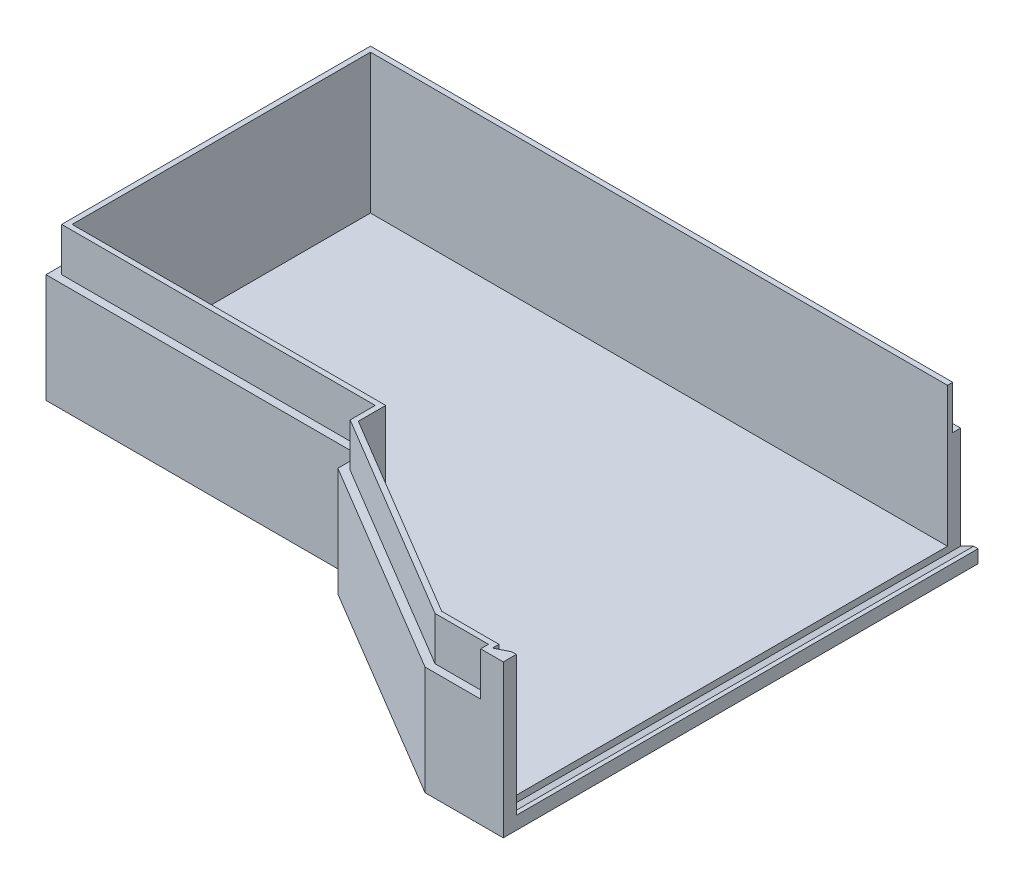
ISO-10303-21;
HEADER;
FILE_DESCRIPTION(('STEP AP214'),'2;1');
FILE_NAME('part.step','',(''),(''),'','','');
FILE_SCHEMA(('AUTOMOTIVE_DESIGN { 1 0 10303 214 1 1 1 1 }'));
ENDSEC;
DATA;
#1=APPLICATION_CONTEXT('core data for automotive mechanical design processes');
#2=APPLICATION_PROTOCOL_DEFINITION('international standard','automotive_design',2000,#1);
#3=PRODUCT_CONTEXT('',#1,'mechanical');
#4=PRODUCT('Part','Part','',(#3));
#5=PRODUCT_RELATED_PRODUCT_CATEGORY('part','',(#4));
#6=PRODUCT_DEFINITION_FORMATION('','',#4);
#7=PRODUCT_DEFINITION_CONTEXT('part definition',#1,'design');
#8=PRODUCT_DEFINITION('design','',#6,#7);
#9=PRODUCT_DEFINITION_SHAPE('','',#8);
#10=(LENGTH_UNIT() NAMED_UNIT(*) SI_UNIT(.MILLI.,.METRE.));
#11=(NAMED_UNIT(*) PLANE_ANGLE_UNIT() SI_UNIT($,.RADIAN.));
#12=(NAMED_UNIT(*) SI_UNIT($,.STERADIAN.) SOLID_ANGLE_UNIT());
#13=UNCERTAINTY_MEASURE_WITH_UNIT(LENGTH_MEASURE(1.E-05),#10,'distance_accuracy_value','');
#14=(GEOMETRIC_REPRESENTATION_CONTEXT(3) GLOBAL_UNCERTAINTY_ASSIGNED_CONTEXT((#13)) GLOBAL_UNIT_ASSIGNED_CONTEXT((#10,
#11,#12)) REPRESENTATION_CONTEXT('',''));
#15=CARTESIAN_POINT('',(0.,0.,0.));
#16=DIRECTION('',(0.,0.,1.));
#17=DIRECTION('',(1.,0.,0.));
#18=AXIS2_PLACEMENT_3D('',#15,#16,#17);
#19=CARTESIAN_POINT('',(118.862351473815,3.,102.5));
#20=DIRECTION('',(0.,0.,1.));
#21=DIRECTION('',(1.,0.,0.));
#22=AXIS2_PLACEMENT_3D('',#19,#20,#21);
#23=PLANE('',#22);
#24=DIRECTION('',(1.,0.,0.));
#25=VECTOR('',#24,1.);
#26=CARTESIAN_POINT('',(118.862351473815,35.,102.5));
#27=LINE('',#26,#25);
#28=CARTESIAN_POINT('',(118.862351473815,35.,102.5));
#29=VERTEX_POINT('',#28);
#30=CARTESIAN_POINT('',(132.,35.,102.5));
#31=VERTEX_POINT('',#30);
#32=EDGE_CURVE('E249',#29,#31,#27,.T.);
#33=ORIENTED_EDGE('',*,*,#32,.T.);
#34=DIRECTION('',(0.,1.,0.));
#35=VECTOR('',#34,1.);
#36=CARTESIAN_POINT('',(132.,1.5,102.5));
#37=LINE('',#36,#35);
#38=CARTESIAN_POINT('',(132.,3.,102.5));
#39=VERTEX_POINT('',#38);
#40=EDGE_CURVE('E370',#39,#31,#37,.T.);
#41=ORIENTED_EDGE('',*,*,#40,.F.);
#42=DIRECTION('',(1.,0.,0.));
#43=VECTOR('',#42,1.);
#44=CARTESIAN_POINT('',(118.862351473815,3.,102.5));
#45=LINE('',#44,#43);
#46=CARTESIAN_POINT('',(118.862351473815,3.,102.5));
#47=VERTEX_POINT('',#46);
#48=EDGE_CURVE('E251',#47,#39,#45,.T.);
#49=ORIENTED_EDGE('',*,*,#48,.F.);
#50=DIRECTION('',(0.,1.,0.));
#51=VECTOR('',#50,1.);
#52=CARTESIAN_POINT('',(118.862351473815,3.,102.5));
#53=LINE('',#52,#51);
#54=EDGE_CURVE('E167',#47,#29,#53,.T.);
#55=ORIENTED_EDGE('',*,*,#54,.T.);
#56=EDGE_LOOP('',(#33,#41,#49,#55));
#57=FACE_BOUND('',#56,.T.);
#58=ADVANCED_FACE('F45',(#57),#23,.F.);
#59=CARTESIAN_POINT('',(0.,3.,0.));
#60=DIRECTION('',(0.,1.,0.));
#61=DIRECTION('',(0.,0.,1.));
#62=AXIS2_PLACEMENT_3D('',#59,#60,#61);
#63=PLANE('',#62);
#64=DIRECTION('',(0.,0.,1.));
#65=VECTOR('',#64,1.);
#66=CARTESIAN_POINT('',(132.,3.,-3.5));
#67=LINE('',#66,#65);
#68=CARTESIAN_POINT('',(132.,3.,-0.5));
#69=VERTEX_POINT('',#68);
#70=EDGE_CURVE('E381',#69,#39,#67,.T.);
#71=ORIENTED_EDGE('',*,*,#70,.F.);
#72=DIRECTION('',(-1.,0.,0.));
#73=VECTOR('',#72,1.);
#74=CARTESIAN_POINT('',(133.,3.,-0.5));
#75=LINE('',#74,#73);
#76=CARTESIAN_POINT('',(-0.5,3.,-0.5));
#77=VERTEX_POINT('',#76);
#78=EDGE_CURVE('E266',#69,#77,#75,.T.);
#79=ORIENTED_EDGE('',*,*,#78,.T.);
#80=DIRECTION('',(0.,0.,1.));
#81=VECTOR('',#80,1.);
#82=CARTESIAN_POINT('',(-0.5,3.,-0.5));
#83=LINE('',#82,#81);
#84=CARTESIAN_POINT('',(-0.5,3.,68.));
#85=VERTEX_POINT('',#84);
#86=EDGE_CURVE('E270',#77,#85,#83,.T.);
#87=ORIENTED_EDGE('',*,*,#86,.T.);
#88=DIRECTION('',(1.,0.,0.));
#89=VECTOR('',#88,1.);
#90=CARTESIAN_POINT('',(-0.5,3.,68.));
#91=LINE('',#90,#89);
#92=CARTESIAN_POINT('',(71.5,3.,68.));
#93=VERTEX_POINT('',#92);
#94=EDGE_CURVE('E319',#85,#93,#91,.T.);
#95=ORIENTED_EDGE('',*,*,#94,.T.);
#96=DIRECTION('',(0.,0.,1.));
#97=VECTOR('',#96,1.);
#98=CARTESIAN_POINT('',(71.5,3.,68.));
#99=LINE('',#98,#97);
#100=CARTESIAN_POINT('',(71.5,3.,74.2841310368762));
#101=VERTEX_POINT('',#100);
#102=EDGE_CURVE('E415',#93,#101,#99,.T.);
#103=ORIENTED_EDGE('',*,*,#102,.T.);
#104=DIRECTION('',(0.859101543908756,0.,0.511805175094578));
#105=VECTOR('',#104,1.);
#106=CARTESIAN_POINT('',(71.5,3.,74.2841310368762));
#107=LINE('',#106,#105);
#108=EDGE_CURVE('E295',#101,#47,#107,.T.);
#109=ORIENTED_EDGE('',*,*,#108,.T.);
#110=ORIENTED_EDGE('',*,*,#48,.T.);
#111=EDGE_LOOP('',(#71,#79,#87,#95,#103,#109,#110));
#112=FACE_BOUND('',#111,.T.);
#113=ADVANCED_FACE('F335',(#112),#63,.T.);
#114=CARTESIAN_POINT('',(-3.5,35.,-3.5));
#115=DIRECTION('',(0.,0.,-1.));
#116=DIRECTION('',(-1.,0.,0.));
#117=AXIS2_PLACEMENT_3D('',#114,#115,#116);
#118=PLANE('',#117);
#119=DIRECTION('',(-0.894427190999916,-0.447213595499958,0.));
#120=VECTOR('',#119,1.);
#121=CARTESIAN_POINT('',(132.,1.5,-3.5));
#122=LINE('',#121,#120);
#123=CARTESIAN_POINT('',(135.,3.,-3.5));
#124=VERTEX_POINT('',#123);
#125=CARTESIAN_POINT('',(132.,1.5,-3.5));
#126=VERTEX_POINT('',#125);
#127=EDGE_CURVE('E450',#124,#126,#122,.T.);
#128=ORIENTED_EDGE('',*,*,#127,.F.);
#129=DIRECTION('',(-1.,0.,0.));
#130=VECTOR('',#129,1.);
#131=CARTESIAN_POINT('',(136.,3.,-3.5));
#132=LINE('',#131,#130);
#133=CARTESIAN_POINT('',(136.,3.,-3.5));
#134=VERTEX_POINT('',#133);
#135=EDGE_CURVE('E397',#134,#124,#132,.T.);
#136=ORIENTED_EDGE('',*,*,#135,.F.);
#137=DIRECTION('',(0.,-1.,0.));
#138=VECTOR('',#137,1.);
#139=CARTESIAN_POINT('',(136.,35.,-3.5));
#140=LINE('',#139,#138);
#141=CARTESIAN_POINT('',(136.,0.,-3.5));
#142=VERTEX_POINT('',#141);
#143=EDGE_CURVE('E151',#134,#142,#140,.T.);
#144=ORIENTED_EDGE('',*,*,#143,.T.);
#145=DIRECTION('',(1.,0.,0.));
#146=VECTOR('',#145,1.);
#147=CARTESIAN_POINT('',(-3.5,0.,-3.5));
#148=LINE('',#147,#146);
#149=CARTESIAN_POINT('',(-3.5,0.,-3.5));
#150=VERTEX_POINT('',#149);
#151=EDGE_CURVE('E122',#150,#142,#148,.T.);
#152=ORIENTED_EDGE('',*,*,#151,.F.);
#153=DIRECTION('',(0.,-1.,0.));
#154=VECTOR('',#153,1.);
#155=CARTESIAN_POINT('',(-3.5,35.,-3.5));
#156=LINE('',#155,#154);
#157=CARTESIAN_POINT('',(-3.5,25.,-3.5));
#158=VERTEX_POINT('',#157);
#159=EDGE_CURVE('E54',#158,#150,#156,.T.);
#160=ORIENTED_EDGE('',*,*,#159,.F.);
#161=DIRECTION('',(-1.,0.,0.));
#162=VECTOR('',#161,1.);
#163=CARTESIAN_POINT('',(-3.5,25.,-3.5));
#164=LINE('',#163,#162);
#165=CARTESIAN_POINT('',(132.,25.,-3.5));
#166=VERTEX_POINT('',#165);
#167=EDGE_CURVE('E502',#166,#158,#164,.T.);
#168=ORIENTED_EDGE('',*,*,#167,.F.);
#169=DIRECTION('',(0.,1.,0.));
#170=VECTOR('',#169,1.);
#171=CARTESIAN_POINT('',(132.,3.,-3.5));
#172=LINE('',#171,#170);
#173=EDGE_CURVE('E401',#126,#166,#172,.T.);
#174=ORIENTED_EDGE('',*,*,#173,.F.);
#175=EDGE_LOOP('',(#128,#136,#144,#152,#160,#168,#174));
#176=FACE_BOUND('',#175,.T.);
#177=ADVANCED_FACE('F341',(#176),#118,.T.);
#178=CARTESIAN_POINT('',(-3.5,35.,-3.5));
#179=DIRECTION('',(1.,0.,0.));
#180=DIRECTION('',(0.,0.,-1.));
#181=AXIS2_PLACEMENT_3D('',#178,#179,#180);
#182=PLANE('',#181);
#183=DIRECTION('',(0.,-1.,0.));
#184=VECTOR('',#183,1.);
#185=CARTESIAN_POINT('',(-3.5,35.,71.));
#186=LINE('',#185,#184);
#187=CARTESIAN_POINT('',(-3.5,25.,71.));
#188=VERTEX_POINT('',#187);
#189=CARTESIAN_POINT('',(-3.5,0.,71.));
#190=VERTEX_POINT('',#189);
#191=EDGE_CURVE('E99',#188,#190,#186,.T.);
#192=ORIENTED_EDGE('',*,*,#191,.F.);
#193=DIRECTION('',(0.,0.,1.));
#194=VECTOR('',#193,1.);
#195=CARTESIAN_POINT('',(-3.5,25.,71.));
#196=LINE('',#195,#194);
#197=EDGE_CURVE('E506',#158,#188,#196,.T.);
#198=ORIENTED_EDGE('',*,*,#197,.F.);
#199=ORIENTED_EDGE('',*,*,#159,.T.);
#200=DIRECTION('',(0.,0.,1.));
#201=VECTOR('',#200,1.);
#202=CARTESIAN_POINT('',(-3.5,0.,-3.5));
#203=LINE('',#202,#201);
#204=EDGE_CURVE('E115',#150,#190,#203,.T.);
#205=ORIENTED_EDGE('',*,*,#204,.T.);
#206=EDGE_LOOP('',(#192,#198,#199,#205));
#207=FACE_BOUND('',#206,.T.);
#208=ADVANCED_FACE('F116',(#207),#182,.F.);
#209=CARTESIAN_POINT('',(-3.5,35.,71.));
#210=DIRECTION('',(0.,0.,-1.));
#211=DIRECTION('',(-1.,0.,0.));
#212=AXIS2_PLACEMENT_3D('',#209,#210,#211);
#213=PLANE('',#212);
#214=DIRECTION('',(0.,-1.,0.));
#215=VECTOR('',#214,1.);
#216=CARTESIAN_POINT('',(68.5,35.,71.));
#217=LINE('',#216,#215);
#218=CARTESIAN_POINT('',(68.5,25.,71.));
#219=VERTEX_POINT('',#218);
#220=CARTESIAN_POINT('',(68.5,0.,71.));
#221=VERTEX_POINT('',#220);
#222=EDGE_CURVE('E112',#219,#221,#217,.T.);
#223=ORIENTED_EDGE('',*,*,#222,.F.);
#224=DIRECTION('',(1.,0.,0.));
#225=VECTOR('',#224,1.);
#226=CARTESIAN_POINT('',(68.5,25.,71.));
#227=LINE('',#226,#225);
#228=EDGE_CURVE('E108',#188,#219,#227,.T.);
#229=ORIENTED_EDGE('',*,*,#228,.F.);
#230=ORIENTED_EDGE('',*,*,#191,.T.);
#231=DIRECTION('',(1.,0.,0.));
#232=VECTOR('',#231,1.);
#233=CARTESIAN_POINT('',(-3.5,0.,71.));
#234=LINE('',#233,#232);
#235=EDGE_CURVE('E104',#190,#221,#234,.T.);
#236=ORIENTED_EDGE('',*,*,#235,.T.);
#237=EDGE_LOOP('',(#223,#229,#230,#236));
#238=FACE_BOUND('',#237,.T.);
#239=ADVANCED_FACE('F102',(#238),#213,.F.);
#240=CARTESIAN_POINT('',(68.5,35.,71.));
#241=DIRECTION('',(1.,0.,0.));
#242=DIRECTION('',(0.,0.,-1.));
#243=AXIS2_PLACEMENT_3D('',#240,#241,#242);
#244=PLANE('',#243);
#245=DIRECTION('',(0.,-1.,0.));
#246=VECTOR('',#245,1.);
#247=CARTESIAN_POINT('',(68.5,35.,75.9889172581332));
#248=LINE('',#247,#246);
#249=CARTESIAN_POINT('',(68.5,25.,75.9889172581332));
#250=VERTEX_POINT('',#249);
#251=CARTESIAN_POINT('',(68.5,0.,75.9889172581332));
#252=VERTEX_POINT('',#251);
#253=EDGE_CURVE('E142',#250,#252,#248,.T.);
#254=ORIENTED_EDGE('',*,*,#253,.F.);
#255=DIRECTION('',(0.,0.,1.));
#256=VECTOR('',#255,1.);
#257=CARTESIAN_POINT('',(68.5,25.,75.9889172581332));
#258=LINE('',#257,#256);
#259=EDGE_CURVE('E462',#219,#250,#258,.T.);
#260=ORIENTED_EDGE('',*,*,#259,.F.);
#261=ORIENTED_EDGE('',*,*,#222,.T.);
#262=DIRECTION('',(0.,0.,1.));
#263=VECTOR('',#262,1.);
#264=CARTESIAN_POINT('',(68.5,0.,71.));
#265=LINE('',#264,#263);
#266=EDGE_CURVE('E127',#221,#252,#265,.T.);
#267=ORIENTED_EDGE('',*,*,#266,.T.);
#268=EDGE_LOOP('',(#254,#260,#261,#267));
#269=FACE_BOUND('',#268,.T.);
#270=ADVANCED_FACE('F636',(#269),#244,.F.);
#271=CARTESIAN_POINT('',(68.5,35.,75.9889172581332));
#272=DIRECTION('',(0.511805175094578,0.,-0.859101543908756));
#273=DIRECTION('',(-0.859101543908756,0.,-0.511805175094578));
#274=AXIS2_PLACEMENT_3D('',#271,#272,#273);
#275=PLANE('',#274);
#276=DIRECTION('',(0.,-1.,0.));
#277=VECTOR('',#276,1.);
#278=CARTESIAN_POINT('',(118.036460316705,35.,105.5));
#279=LINE('',#278,#277);
#280=CARTESIAN_POINT('',(118.036460316705,25.,105.5));
#281=VERTEX_POINT('',#280);
#282=CARTESIAN_POINT('',(118.036460316705,0.,105.5));
#283=VERTEX_POINT('',#282);
#284=EDGE_CURVE('E145',#281,#283,#279,.T.);
#285=ORIENTED_EDGE('',*,*,#284,.F.);
#286=DIRECTION('',(0.859101543908756,0.,0.511805175094578));
#287=VECTOR('',#286,1.);
#288=CARTESIAN_POINT('',(118.036460316705,25.,105.5));
#289=LINE('',#288,#287);
#290=EDGE_CURVE('E466',#250,#281,#289,.T.);
#291=ORIENTED_EDGE('',*,*,#290,.F.);
#292=ORIENTED_EDGE('',*,*,#253,.T.);
#293=DIRECTION('',(0.859101543908756,0.,0.511805175094578));
#294=VECTOR('',#293,1.);
#295=CARTESIAN_POINT('',(68.5,0.,75.9889172581332));
#296=LINE('',#295,#294);
#297=EDGE_CURVE('E131',#252,#283,#296,.T.);
#298=ORIENTED_EDGE('',*,*,#297,.T.);
#299=EDGE_LOOP('',(#285,#291,#292,#298));
#300=FACE_BOUND('',#299,.T.);
#301=ADVANCED_FACE('F174',(#300),#275,.F.);
#302=CARTESIAN_POINT('',(135.,35.,105.5));
#303=DIRECTION('',(0.,0.,1.));
#304=DIRECTION('',(1.,0.,0.));
#305=AXIS2_PLACEMENT_3D('',#302,#303,#304);
#306=PLANE('',#305);
#307=DIRECTION('',(0.,1.,0.));
#308=VECTOR('',#307,1.);
#309=CARTESIAN_POINT('',(130.8,25.,105.5));
#310=LINE('',#309,#308);
#311=CARTESIAN_POINT('',(130.8,25.,105.5));
#312=VERTEX_POINT('',#311);
#313=CARTESIAN_POINT('',(130.8,35.,105.5));
#314=VERTEX_POINT('',#313);
#315=EDGE_CURVE('E509',#312,#314,#310,.T.);
#316=ORIENTED_EDGE('',*,*,#315,.F.);
#317=DIRECTION('',(1.,0.,0.));
#318=VECTOR('',#317,1.);
#319=CARTESIAN_POINT('',(130.8,25.,105.5));
#320=LINE('',#319,#318);
#321=EDGE_CURVE('E470',#281,#312,#320,.T.);
#322=ORIENTED_EDGE('',*,*,#321,.F.);
#323=ORIENTED_EDGE('',*,*,#284,.T.);
#324=DIRECTION('',(-1.,0.,0.));
#325=VECTOR('',#324,1.);
#326=CARTESIAN_POINT('',(135.,0.,105.5));
#327=LINE('',#326,#325);
#328=CARTESIAN_POINT('',(136.,0.,105.5));
#329=VERTEX_POINT('',#328);
#330=EDGE_CURVE('E166',#329,#283,#327,.T.);
#331=ORIENTED_EDGE('',*,*,#330,.F.);
#332=DIRECTION('',(0.,-1.,0.));
#333=VECTOR('',#332,1.);
#334=CARTESIAN_POINT('',(136.,35.,105.5));
#335=LINE('',#334,#333);
#336=CARTESIAN_POINT('',(136.,35.,105.5));
#337=VERTEX_POINT('',#336);
#338=EDGE_CURVE('E148',#337,#329,#335,.T.);
#339=ORIENTED_EDGE('',*,*,#338,.F.);
#340=DIRECTION('',(1.,0.,0.));
#341=VECTOR('',#340,1.);
#342=CARTESIAN_POINT('',(135.,35.,105.5));
#343=LINE('',#342,#341);
#344=EDGE_CURVE('E70',#314,#337,#343,.T.);
#345=ORIENTED_EDGE('',*,*,#344,.F.);
#346=EDGE_LOOP('',(#316,#322,#323,#331,#339,#345));
#347=FACE_BOUND('',#346,.T.);
#348=ADVANCED_FACE('F182',(#347),#306,.T.);
#349=CARTESIAN_POINT('',(136.,35.,-3.5));
#350=DIRECTION('',(1.,0.,0.));
#351=DIRECTION('',(0.,0.,-1.));
#352=AXIS2_PLACEMENT_3D('',#349,#350,#351);
#353=PLANE('',#352);
#354=DIRECTION('',(0.,1.,0.));
#355=VECTOR('',#354,1.);
#356=CARTESIAN_POINT('',(136.,3.,102.5));
#357=LINE('',#356,#355);
#358=CARTESIAN_POINT('',(136.,3.,102.5));
#359=VERTEX_POINT('',#358);
#360=CARTESIAN_POINT('',(136.,35.,102.5));
#361=VERTEX_POINT('',#360);
#362=EDGE_CURVE('E189',#359,#361,#357,.T.);
#363=ORIENTED_EDGE('',*,*,#362,.T.);
#364=DIRECTION('',(0.,0.,1.));
#365=VECTOR('',#364,1.);
#366=CARTESIAN_POINT('',(136.,35.,-3.5));
#367=LINE('',#366,#365);
#368=EDGE_CURVE('E137',#361,#337,#367,.T.);
#369=ORIENTED_EDGE('',*,*,#368,.T.);
#370=ORIENTED_EDGE('',*,*,#338,.T.);
#371=DIRECTION('',(0.,0.,1.));
#372=VECTOR('',#371,1.);
#373=CARTESIAN_POINT('',(136.,0.,-3.5));
#374=LINE('',#373,#372);
#375=EDGE_CURVE('E162',#142,#329,#374,.T.);
#376=ORIENTED_EDGE('',*,*,#375,.F.);
#377=ORIENTED_EDGE('',*,*,#143,.F.);
#378=DIRECTION('',(0.,0.,-1.));
#379=VECTOR('',#378,1.);
#380=CARTESIAN_POINT('',(136.,3.,-3.5));
#381=LINE('',#380,#379);
#382=EDGE_CURVE('E394',#359,#134,#381,.T.);
#383=ORIENTED_EDGE('',*,*,#382,.F.);
#384=EDGE_LOOP('',(#363,#369,#370,#376,#377,#383));
#385=FACE_BOUND('',#384,.T.);
#386=ADVANCED_FACE('F47',(#385),#353,.T.);
#387=CARTESIAN_POINT('',(0.,35.,0.));
#388=DIRECTION('',(0.,-1.,0.));
#389=DIRECTION('',(0.,0.,-1.));
#390=AXIS2_PLACEMENT_3D('',#387,#388,#389);
#391=PLANE('',#390);
#392=CARTESIAN_POINT('',(135.,35.,102.5));
#393=VERTEX_POINT('',#392);
#394=EDGE_CURVE('E195',#393,#361,#27,.T.);
#395=ORIENTED_EDGE('',*,*,#394,.F.);
#396=DIRECTION('',(-0.894427190999916,0.,0.447213595499958));
#397=VECTOR('',#396,1.);
#398=CARTESIAN_POINT('',(132.,35.,104.));
#399=LINE('',#398,#397);
#400=CARTESIAN_POINT('',(132.,35.,104.));
#401=VERTEX_POINT('',#400);
#402=EDGE_CURVE('E367',#393,#401,#399,.T.);
#403=ORIENTED_EDGE('',*,*,#402,.T.);
#404=DIRECTION('',(0.,0.,-1.));
#405=VECTOR('',#404,1.);
#406=CARTESIAN_POINT('',(132.,35.,104.));
#407=LINE('',#406,#405);
#408=EDGE_CURVE('E264',#401,#31,#407,.T.);
#409=ORIENTED_EDGE('',*,*,#408,.T.);
#410=ORIENTED_EDGE('',*,*,#32,.F.);
#411=DIRECTION('',(0.859101543908756,0.,0.511805175094578));
#412=VECTOR('',#411,1.);
#413=CARTESIAN_POINT('',(71.5,35.,74.2841310368762));
#414=LINE('',#413,#412);
#415=CARTESIAN_POINT('',(71.5,35.,74.2841310368762));
#416=VERTEX_POINT('',#415);
#417=EDGE_CURVE('E256',#416,#29,#414,.T.);
#418=ORIENTED_EDGE('',*,*,#417,.F.);
#419=DIRECTION('',(0.,0.,1.));
#420=VECTOR('',#419,1.);
#421=CARTESIAN_POINT('',(71.5,35.,68.));
#422=LINE('',#421,#420);
#423=CARTESIAN_POINT('',(71.5,35.,68.));
#424=VERTEX_POINT('',#423);
#425=EDGE_CURVE('E260',#424,#416,#422,.T.);
#426=ORIENTED_EDGE('',*,*,#425,.F.);
#427=DIRECTION('',(1.,0.,0.));
#428=VECTOR('',#427,1.);
#429=CARTESIAN_POINT('',(-0.5,35.,68.));
#430=LINE('',#429,#428);
#431=CARTESIAN_POINT('',(-0.5,35.,68.));
#432=VERTEX_POINT('',#431);
#433=EDGE_CURVE('E306',#432,#424,#430,.T.);
#434=ORIENTED_EDGE('',*,*,#433,.F.);
#435=DIRECTION('',(0.,0.,1.));
#436=VECTOR('',#435,1.);
#437=CARTESIAN_POINT('',(-0.5,35.,-0.5));
#438=LINE('',#437,#436);
#439=CARTESIAN_POINT('',(-0.5,35.,-0.5));
#440=VERTEX_POINT('',#439);
#441=EDGE_CURVE('E302',#440,#432,#438,.T.);
#442=ORIENTED_EDGE('',*,*,#441,.F.);
#443=DIRECTION('',(-1.,0.,0.));
#444=VECTOR('',#443,1.);
#445=CARTESIAN_POINT('',(133.,35.,-0.5));
#446=LINE('',#445,#444);
#447=CARTESIAN_POINT('',(132.,35.,-0.5));
#448=VERTEX_POINT('',#447);
#449=EDGE_CURVE('E299',#448,#440,#446,.T.);
#450=ORIENTED_EDGE('',*,*,#449,.F.);
#451=DIRECTION('',(0.,0.,1.));
#452=VECTOR('',#451,1.);
#453=CARTESIAN_POINT('',(132.,35.,-3.5));
#454=LINE('',#453,#452);
#455=CARTESIAN_POINT('',(132.,35.,-1.7));
#456=VERTEX_POINT('',#455);
#457=EDGE_CURVE('E386',#456,#448,#454,.T.);
#458=ORIENTED_EDGE('',*,*,#457,.F.);
#459=DIRECTION('',(1.,0.,0.));
#460=VECTOR('',#459,1.);
#461=CARTESIAN_POINT('',(132.,35.,-1.7));
#462=LINE('',#461,#460);
#463=CARTESIAN_POINT('',(-1.7,35.,-1.7));
#464=VERTEX_POINT('',#463);
#465=EDGE_CURVE('E431',#464,#456,#462,.T.);
#466=ORIENTED_EDGE('',*,*,#465,.F.);
#467=DIRECTION('',(0.,0.,-1.));
#468=VECTOR('',#467,1.);
#469=CARTESIAN_POINT('',(-1.7,35.,-1.7));
#470=LINE('',#469,#468);
#471=CARTESIAN_POINT('',(-1.7,35.,69.2));
#472=VERTEX_POINT('',#471);
#473=EDGE_CURVE('E526',#472,#464,#470,.T.);
#474=ORIENTED_EDGE('',*,*,#473,.F.);
#475=DIRECTION('',(-1.,0.,0.));
#476=VECTOR('',#475,1.);
#477=CARTESIAN_POINT('',(-1.7,35.,69.2));
#478=LINE('',#477,#476);
#479=CARTESIAN_POINT('',(70.3,35.,69.2));
#480=VERTEX_POINT('',#479);
#481=EDGE_CURVE('E522',#480,#472,#478,.T.);
#482=ORIENTED_EDGE('',*,*,#481,.F.);
#483=DIRECTION('',(0.,0.,-1.));
#484=VECTOR('',#483,1.);
#485=CARTESIAN_POINT('',(70.3,35.,69.2));
#486=LINE('',#485,#484);
#487=CARTESIAN_POINT('',(70.3,35.,74.966045525379));
#488=VERTEX_POINT('',#487);
#489=EDGE_CURVE('E518',#488,#480,#486,.T.);
#490=ORIENTED_EDGE('',*,*,#489,.F.);
#491=DIRECTION('',(-0.859101543908756,0.,-0.511805175094578));
#492=VECTOR('',#491,1.);
#493=CARTESIAN_POINT('',(70.3,35.,74.966045525379));
#494=LINE('',#493,#492);
#495=CARTESIAN_POINT('',(118.531995010971,35.,103.7));
#496=VERTEX_POINT('',#495);
#497=EDGE_CURVE('E514',#496,#488,#494,.T.);
#498=ORIENTED_EDGE('',*,*,#497,.F.);
#499=DIRECTION('',(-1.,0.,0.));
#500=VECTOR('',#499,1.);
#501=CARTESIAN_POINT('',(118.531995010971,35.,103.7));
#502=LINE('',#501,#500);
#503=CARTESIAN_POINT('',(130.8,35.,103.7));
#504=VERTEX_POINT('',#503);
#505=EDGE_CURVE('E455',#504,#496,#502,.T.);
#506=ORIENTED_EDGE('',*,*,#505,.F.);
#507=DIRECTION('',(0.,0.,-1.));
#508=VECTOR('',#507,1.);
#509=CARTESIAN_POINT('',(130.8,35.,103.7));
#510=LINE('',#509,#508);
#511=EDGE_CURVE('E449',#314,#504,#510,.T.);
#512=ORIENTED_EDGE('',*,*,#511,.F.);
#513=ORIENTED_EDGE('',*,*,#344,.T.);
#514=ORIENTED_EDGE('',*,*,#368,.F.);
#515=EDGE_LOOP('',(#395,#403,#409,#410,#418,#426,#434,#442,#450,#458,#466,#474,#482,#490,#498,
#506,#512,#513,#514));
#516=FACE_BOUND('',#515,.T.);
#517=ADVANCED_FACE('F191',(#516),#391,.F.);
#518=CARTESIAN_POINT('',(0.,0.,0.));
#519=DIRECTION('',(0.,-1.,0.));
#520=DIRECTION('',(0.,0.,-1.));
#521=AXIS2_PLACEMENT_3D('',#518,#519,#520);
#522=PLANE('',#521);
#523=ORIENTED_EDGE('',*,*,#151,.T.);
#524=ORIENTED_EDGE('',*,*,#375,.T.);
#525=ORIENTED_EDGE('',*,*,#330,.T.);
#526=ORIENTED_EDGE('',*,*,#297,.F.);
#527=ORIENTED_EDGE('',*,*,#266,.F.);
#528=ORIENTED_EDGE('',*,*,#235,.F.);
#529=ORIENTED_EDGE('',*,*,#204,.F.);
#530=EDGE_LOOP('',(#523,#524,#525,#526,#527,#528,#529));
#531=FACE_BOUND('',#530,.T.);
#532=ADVANCED_FACE('F124',(#531),#522,.T.);
#533=CARTESIAN_POINT('',(135.,3.,102.5));
#534=VERTEX_POINT('',#533);
#535=EDGE_CURVE('E290',#534,#359,#45,.T.);
#536=ORIENTED_EDGE('',*,*,#535,.F.);
#537=DIRECTION('',(0.,-1.,0.));
#538=VECTOR('',#537,1.);
#539=CARTESIAN_POINT('',(135.,1.5,102.5));
#540=LINE('',#539,#538);
#541=EDGE_CURVE('E355',#393,#534,#540,.T.);
#542=ORIENTED_EDGE('',*,*,#541,.F.);
#543=ORIENTED_EDGE('',*,*,#394,.T.);
#544=ORIENTED_EDGE('',*,*,#362,.F.);
#545=EDGE_LOOP('',(#536,#542,#543,#544));
#546=FACE_BOUND('',#545,.T.);
#547=ADVANCED_FACE('F337',(#546),#23,.F.);
#548=CARTESIAN_POINT('',(71.5,3.,74.2841310368762));
#549=DIRECTION('',(-0.511805175094578,0.,0.859101543908756));
#550=DIRECTION('',(0.859101543908756,0.,0.511805175094578));
#551=AXIS2_PLACEMENT_3D('',#548,#549,#550);
#552=PLANE('',#551);
#553=ORIENTED_EDGE('',*,*,#417,.T.);
#554=ORIENTED_EDGE('',*,*,#54,.F.);
#555=ORIENTED_EDGE('',*,*,#108,.F.);
#556=DIRECTION('',(0.,1.,0.));
#557=VECTOR('',#556,1.);
#558=CARTESIAN_POINT('',(71.5,3.,74.2841310368762));
#559=LINE('',#558,#557);
#560=EDGE_CURVE('E240',#101,#416,#559,.T.);
#561=ORIENTED_EDGE('',*,*,#560,.T.);
#562=EDGE_LOOP('',(#553,#554,#555,#561));
#563=FACE_BOUND('',#562,.T.);
#564=ADVANCED_FACE('F257',(#563),#552,.F.);
#565=CARTESIAN_POINT('',(71.5,3.,68.));
#566=DIRECTION('',(-1.,0.,0.));
#567=DIRECTION('',(0.,0.,1.));
#568=AXIS2_PLACEMENT_3D('',#565,#566,#567);
#569=PLANE('',#568);
#570=ORIENTED_EDGE('',*,*,#425,.T.);
#571=ORIENTED_EDGE('',*,*,#560,.F.);
#572=ORIENTED_EDGE('',*,*,#102,.F.);
#573=DIRECTION('',(0.,1.,0.));
#574=VECTOR('',#573,1.);
#575=CARTESIAN_POINT('',(71.5,3.,68.));
#576=LINE('',#575,#574);
#577=EDGE_CURVE('E276',#93,#424,#576,.T.);
#578=ORIENTED_EDGE('',*,*,#577,.T.);
#579=EDGE_LOOP('',(#570,#571,#572,#578));
#580=FACE_BOUND('',#579,.T.);
#581=ADVANCED_FACE('F311',(#580),#569,.F.);
#582=CARTESIAN_POINT('',(-0.5,3.,68.));
#583=DIRECTION('',(0.,0.,1.));
#584=DIRECTION('',(1.,0.,0.));
#585=AXIS2_PLACEMENT_3D('',#582,#583,#584);
#586=PLANE('',#585);
#587=ORIENTED_EDGE('',*,*,#433,.T.);
#588=ORIENTED_EDGE('',*,*,#577,.F.);
#589=ORIENTED_EDGE('',*,*,#94,.F.);
#590=DIRECTION('',(0.,1.,0.));
#591=VECTOR('',#590,1.);
#592=CARTESIAN_POINT('',(-0.5,3.,68.));
#593=LINE('',#592,#591);
#594=EDGE_CURVE('E279',#85,#432,#593,.T.);
#595=ORIENTED_EDGE('',*,*,#594,.T.);
#596=EDGE_LOOP('',(#587,#588,#589,#595));
#597=FACE_BOUND('',#596,.T.);
#598=ADVANCED_FACE('F316',(#597),#586,.F.);
#599=CARTESIAN_POINT('',(-0.5,3.,-0.5));
#600=DIRECTION('',(-1.,0.,0.));
#601=DIRECTION('',(0.,0.,1.));
#602=AXIS2_PLACEMENT_3D('',#599,#600,#601);
#603=PLANE('',#602);
#604=ORIENTED_EDGE('',*,*,#441,.T.);
#605=ORIENTED_EDGE('',*,*,#594,.F.);
#606=ORIENTED_EDGE('',*,*,#86,.F.);
#607=DIRECTION('',(0.,1.,0.));
#608=VECTOR('',#607,1.);
#609=CARTESIAN_POINT('',(-0.5,3.,-0.5));
#610=LINE('',#609,#608);
#611=EDGE_CURVE('E281',#77,#440,#610,.T.);
#612=ORIENTED_EDGE('',*,*,#611,.T.);
#613=EDGE_LOOP('',(#604,#605,#606,#612));
#614=FACE_BOUND('',#613,.T.);
#615=ADVANCED_FACE('F321',(#614),#603,.F.);
#616=CARTESIAN_POINT('',(133.,3.,-0.5));
#617=DIRECTION('',(0.,0.,-1.));
#618=DIRECTION('',(-1.,0.,0.));
#619=AXIS2_PLACEMENT_3D('',#616,#617,#618);
#620=PLANE('',#619);
#621=ORIENTED_EDGE('',*,*,#78,.F.);
#622=DIRECTION('',(0.,1.,0.));
#623=VECTOR('',#622,1.);
#624=CARTESIAN_POINT('',(132.,3.,-0.5));
#625=LINE('',#624,#623);
#626=EDGE_CURVE('E303',#69,#448,#625,.T.);
#627=ORIENTED_EDGE('',*,*,#626,.T.);
#628=ORIENTED_EDGE('',*,*,#449,.T.);
#629=ORIENTED_EDGE('',*,*,#611,.F.);
#630=EDGE_LOOP('',(#621,#627,#628,#629));
#631=FACE_BOUND('',#630,.T.);
#632=ADVANCED_FACE('F323',(#631),#620,.F.);
#633=DIRECTION('',(0.,0.,-1.));
#634=VECTOR('',#633,1.);
#635=CARTESIAN_POINT('',(135.,3.,-3.5));
#636=LINE('',#635,#634);
#637=EDGE_CURVE('E387',#534,#124,#636,.T.);
#638=ORIENTED_EDGE('',*,*,#637,.F.);
#639=ORIENTED_EDGE('',*,*,#535,.T.);
#640=ORIENTED_EDGE('',*,*,#382,.T.);
#641=ORIENTED_EDGE('',*,*,#135,.T.);
#642=EDGE_LOOP('',(#638,#639,#640,#641));
#643=FACE_BOUND('',#642,.T.);
#644=ADVANCED_FACE('F330',(#643),#63,.T.);
#645=CARTESIAN_POINT('',(132.,3.,-3.5));
#646=DIRECTION('',(-1.,0.,0.));
#647=DIRECTION('',(0.,0.,1.));
#648=AXIS2_PLACEMENT_3D('',#645,#646,#647);
#649=PLANE('',#648);
#650=DIRECTION('',(0.,0.,-1.));
#651=VECTOR('',#650,1.);
#652=CARTESIAN_POINT('',(132.,25.,-3.5));
#653=LINE('',#652,#651);
#654=CARTESIAN_POINT('',(132.,25.,-1.7));
#655=VERTEX_POINT('',#654);
#656=EDGE_CURVE('E499',#655,#166,#653,.T.);
#657=ORIENTED_EDGE('',*,*,#656,.F.);
#658=DIRECTION('',(0.,1.,0.));
#659=VECTOR('',#658,1.);
#660=CARTESIAN_POINT('',(132.,25.,-1.7));
#661=LINE('',#660,#659);
#662=EDGE_CURVE('E376',#655,#456,#661,.T.);
#663=ORIENTED_EDGE('',*,*,#662,.T.);
#664=ORIENTED_EDGE('',*,*,#457,.T.);
#665=ORIENTED_EDGE('',*,*,#626,.F.);
#666=ORIENTED_EDGE('',*,*,#70,.T.);
#667=ORIENTED_EDGE('',*,*,#40,.T.);
#668=ORIENTED_EDGE('',*,*,#408,.F.);
#669=DIRECTION('',(0.,1.,0.));
#670=VECTOR('',#669,1.);
#671=CARTESIAN_POINT('',(132.,1.5,104.));
#672=LINE('',#671,#670);
#673=CARTESIAN_POINT('',(132.,1.5,104.));
#674=VERTEX_POINT('',#673);
#675=EDGE_CURVE('E369',#674,#401,#672,.T.);
#676=ORIENTED_EDGE('',*,*,#675,.F.);
#677=DIRECTION('',(0.,0.,1.));
#678=VECTOR('',#677,1.);
#679=CARTESIAN_POINT('',(132.,1.5,-3.5));
#680=LINE('',#679,#678);
#681=EDGE_CURVE('E382',#126,#674,#680,.T.);
#682=ORIENTED_EDGE('',*,*,#681,.F.);
#683=ORIENTED_EDGE('',*,*,#173,.T.);
#684=EDGE_LOOP('',(#657,#663,#664,#665,#666,#667,#668,#676,#682,#683));
#685=FACE_BOUND('',#684,.T.);
#686=ADVANCED_FACE('F423',(#685),#649,.F.);
#687=CARTESIAN_POINT('',(132.,25.,-1.7));
#688=DIRECTION('',(0.,0.,1.));
#689=DIRECTION('',(1.,0.,0.));
#690=AXIS2_PLACEMENT_3D('',#687,#688,#689);
#691=PLANE('',#690);
#692=ORIENTED_EDGE('',*,*,#465,.T.);
#693=ORIENTED_EDGE('',*,*,#662,.F.);
#694=DIRECTION('',(1.,0.,0.));
#695=VECTOR('',#694,1.);
#696=CARTESIAN_POINT('',(132.,25.,-1.7));
#697=LINE('',#696,#695);
#698=CARTESIAN_POINT('',(-1.7,25.,-1.7));
#699=VERTEX_POINT('',#698);
#700=EDGE_CURVE('E61',#699,#655,#697,.T.);
#701=ORIENTED_EDGE('',*,*,#700,.F.);
#702=DIRECTION('',(0.,1.,0.));
#703=VECTOR('',#702,1.);
#704=CARTESIAN_POINT('',(-1.7,25.,-1.7));
#705=LINE('',#704,#703);
#706=EDGE_CURVE('E534',#699,#464,#705,.T.);
#707=ORIENTED_EDGE('',*,*,#706,.T.);
#708=EDGE_LOOP('',(#692,#693,#701,#707));
#709=FACE_BOUND('',#708,.T.);
#710=ADVANCED_FACE('F615',(#709),#691,.F.);
#711=CARTESIAN_POINT('',(-1.7,25.,-1.7));
#712=DIRECTION('',(1.,0.,0.));
#713=DIRECTION('',(0.,0.,-1.));
#714=AXIS2_PLACEMENT_3D('',#711,#712,#713);
#715=PLANE('',#714);
#716=ORIENTED_EDGE('',*,*,#473,.T.);
#717=ORIENTED_EDGE('',*,*,#706,.F.);
#718=DIRECTION('',(0.,0.,-1.));
#719=VECTOR('',#718,1.);
#720=CARTESIAN_POINT('',(-1.7,25.,-1.7));
#721=LINE('',#720,#719);
#722=CARTESIAN_POINT('',(-1.7,25.,69.2));
#723=VERTEX_POINT('',#722);
#724=EDGE_CURVE('E494',#723,#699,#721,.T.);
#725=ORIENTED_EDGE('',*,*,#724,.F.);
#726=DIRECTION('',(0.,1.,0.));
#727=VECTOR('',#726,1.);
#728=CARTESIAN_POINT('',(-1.7,25.,69.2));
#729=LINE('',#728,#727);
#730=EDGE_CURVE('E537',#723,#472,#729,.T.);
#731=ORIENTED_EDGE('',*,*,#730,.T.);
#732=EDGE_LOOP('',(#716,#717,#725,#731));
#733=FACE_BOUND('',#732,.T.);
#734=ADVANCED_FACE('F586',(#733),#715,.F.);
#735=CARTESIAN_POINT('',(-1.7,25.,69.2));
#736=DIRECTION('',(0.,0.,-1.));
#737=DIRECTION('',(-1.,0.,0.));
#738=AXIS2_PLACEMENT_3D('',#735,#736,#737);
#739=PLANE('',#738);
#740=ORIENTED_EDGE('',*,*,#481,.T.);
#741=ORIENTED_EDGE('',*,*,#730,.F.);
#742=DIRECTION('',(-1.,0.,0.));
#743=VECTOR('',#742,1.);
#744=CARTESIAN_POINT('',(-1.7,25.,69.2));
#745=LINE('',#744,#743);
#746=CARTESIAN_POINT('',(70.3,25.,69.2));
#747=VERTEX_POINT('',#746);
#748=EDGE_CURVE('E490',#747,#723,#745,.T.);
#749=ORIENTED_EDGE('',*,*,#748,.F.);
#750=DIRECTION('',(0.,1.,0.));
#751=VECTOR('',#750,1.);
#752=CARTESIAN_POINT('',(70.3,25.,69.2));
#753=LINE('',#752,#751);
#754=EDGE_CURVE('E541',#747,#480,#753,.T.);
#755=ORIENTED_EDGE('',*,*,#754,.T.);
#756=EDGE_LOOP('',(#740,#741,#749,#755));
#757=FACE_BOUND('',#756,.T.);
#758=ADVANCED_FACE('F592',(#757),#739,.F.);
#759=CARTESIAN_POINT('',(70.3,25.,69.2));
#760=DIRECTION('',(1.,0.,0.));
#761=DIRECTION('',(0.,0.,-1.));
#762=AXIS2_PLACEMENT_3D('',#759,#760,#761);
#763=PLANE('',#762);
#764=ORIENTED_EDGE('',*,*,#489,.T.);
#765=ORIENTED_EDGE('',*,*,#754,.F.);
#766=DIRECTION('',(0.,0.,-1.));
#767=VECTOR('',#766,1.);
#768=CARTESIAN_POINT('',(70.3,25.,69.2));
#769=LINE('',#768,#767);
#770=CARTESIAN_POINT('',(70.3,25.,74.966045525379));
#771=VERTEX_POINT('',#770);
#772=EDGE_CURVE('E486',#771,#747,#769,.T.);
#773=ORIENTED_EDGE('',*,*,#772,.F.);
#774=DIRECTION('',(0.,1.,0.));
#775=VECTOR('',#774,1.);
#776=CARTESIAN_POINT('',(70.3,25.,74.966045525379));
#777=LINE('',#776,#775);
#778=EDGE_CURVE('E545',#771,#488,#777,.T.);
#779=ORIENTED_EDGE('',*,*,#778,.T.);
#780=EDGE_LOOP('',(#764,#765,#773,#779));
#781=FACE_BOUND('',#780,.T.);
#782=ADVANCED_FACE('F595',(#781),#763,.F.);
#783=CARTESIAN_POINT('',(70.3,25.,74.966045525379));
#784=DIRECTION('',(0.511805175094578,0.,-0.859101543908756));
#785=DIRECTION('',(-0.859101543908756,0.,-0.511805175094578));
#786=AXIS2_PLACEMENT_3D('',#783,#784,#785);
#787=PLANE('',#786);
#788=ORIENTED_EDGE('',*,*,#497,.T.);
#789=ORIENTED_EDGE('',*,*,#778,.F.);
#790=DIRECTION('',(-0.859101543908756,0.,-0.511805175094578));
#791=VECTOR('',#790,1.);
#792=CARTESIAN_POINT('',(70.3,25.,74.966045525379));
#793=LINE('',#792,#791);
#794=CARTESIAN_POINT('',(118.531995010971,25.,103.7));
#795=VERTEX_POINT('',#794);
#796=EDGE_CURVE('E482',#795,#771,#793,.T.);
#797=ORIENTED_EDGE('',*,*,#796,.F.);
#798=DIRECTION('',(0.,1.,0.));
#799=VECTOR('',#798,1.);
#800=CARTESIAN_POINT('',(118.531995010971,25.,103.7));
#801=LINE('',#800,#799);
#802=EDGE_CURVE('E549',#795,#496,#801,.T.);
#803=ORIENTED_EDGE('',*,*,#802,.T.);
#804=EDGE_LOOP('',(#788,#789,#797,#803));
#805=FACE_BOUND('',#804,.T.);
#806=ADVANCED_FACE('F600',(#805),#787,.F.);
#807=CARTESIAN_POINT('',(118.531995010971,25.,103.7));
#808=DIRECTION('',(0.,0.,-1.));
#809=DIRECTION('',(-1.,0.,0.));
#810=AXIS2_PLACEMENT_3D('',#807,#808,#809);
#811=PLANE('',#810);
#812=ORIENTED_EDGE('',*,*,#505,.T.);
#813=ORIENTED_EDGE('',*,*,#802,.F.);
#814=DIRECTION('',(-1.,0.,0.));
#815=VECTOR('',#814,1.);
#816=CARTESIAN_POINT('',(118.531995010971,25.,103.7));
#817=LINE('',#816,#815);
#818=CARTESIAN_POINT('',(130.8,25.,103.7));
#819=VERTEX_POINT('',#818);
#820=EDGE_CURVE('E478',#819,#795,#817,.T.);
#821=ORIENTED_EDGE('',*,*,#820,.F.);
#822=DIRECTION('',(0.,1.,0.));
#823=VECTOR('',#822,1.);
#824=CARTESIAN_POINT('',(130.8,25.,103.7));
#825=LINE('',#824,#823);
#826=EDGE_CURVE('E553',#819,#504,#825,.T.);
#827=ORIENTED_EDGE('',*,*,#826,.T.);
#828=EDGE_LOOP('',(#812,#813,#821,#827));
#829=FACE_BOUND('',#828,.T.);
#830=ADVANCED_FACE('F573',(#829),#811,.F.);
#831=CARTESIAN_POINT('',(130.8,25.,103.7));
#832=DIRECTION('',(1.,0.,0.));
#833=DIRECTION('',(0.,0.,-1.));
#834=AXIS2_PLACEMENT_3D('',#831,#832,#833);
#835=PLANE('',#834);
#836=ORIENTED_EDGE('',*,*,#511,.T.);
#837=ORIENTED_EDGE('',*,*,#826,.F.);
#838=DIRECTION('',(0.,0.,-1.));
#839=VECTOR('',#838,1.);
#840=CARTESIAN_POINT('',(130.8,25.,103.7));
#841=LINE('',#840,#839);
#842=EDGE_CURVE('E474',#312,#819,#841,.T.);
#843=ORIENTED_EDGE('',*,*,#842,.F.);
#844=ORIENTED_EDGE('',*,*,#315,.T.);
#845=EDGE_LOOP('',(#836,#837,#843,#844));
#846=FACE_BOUND('',#845,.T.);
#847=ADVANCED_FACE('F561',(#846),#835,.F.);
#848=CARTESIAN_POINT('',(0.,25.,0.));
#849=DIRECTION('',(0.,-1.,0.));
#850=DIRECTION('',(0.,0.,-1.));
#851=AXIS2_PLACEMENT_3D('',#848,#849,#850);
#852=PLANE('',#851);
#853=ORIENTED_EDGE('',*,*,#228,.T.);
#854=ORIENTED_EDGE('',*,*,#259,.T.);
#855=ORIENTED_EDGE('',*,*,#290,.T.);
#856=ORIENTED_EDGE('',*,*,#321,.T.);
#857=ORIENTED_EDGE('',*,*,#842,.T.);
#858=ORIENTED_EDGE('',*,*,#820,.T.);
#859=ORIENTED_EDGE('',*,*,#796,.T.);
#860=ORIENTED_EDGE('',*,*,#772,.T.);
#861=ORIENTED_EDGE('',*,*,#748,.T.);
#862=ORIENTED_EDGE('',*,*,#724,.T.);
#863=ORIENTED_EDGE('',*,*,#700,.T.);
#864=ORIENTED_EDGE('',*,*,#656,.T.);
#865=ORIENTED_EDGE('',*,*,#167,.T.);
#866=ORIENTED_EDGE('',*,*,#197,.T.);
#867=EDGE_LOOP('',(#853,#854,#855,#856,#857,#858,#859,#860,#861,#862,#863,#864,#865,#866));
#868=FACE_BOUND('',#867,.T.);
#869=ADVANCED_FACE('F613',(#868),#852,.F.);
#870=CARTESIAN_POINT('',(132.,35.,104.));
#871=DIRECTION('',(0.447213595499958,0.,0.894427190999916));
#872=DIRECTION('',(0.894427190999916,0.,-0.447213595499958));
#873=AXIS2_PLACEMENT_3D('',#870,#871,#872);
#874=PLANE('',#873);
#875=ORIENTED_EDGE('',*,*,#541,.T.);
#876=DIRECTION('',(-0.816496580927726,-0.408248290463863,0.408248290463863));
#877=VECTOR('',#876,1.);
#878=CARTESIAN_POINT('',(143.166666666667,7.08333333333333,98.4166666666667));
#879=LINE('',#878,#877);
#880=EDGE_CURVE('E11',#534,#674,#879,.T.);
#881=ORIENTED_EDGE('',*,*,#880,.T.);
#882=ORIENTED_EDGE('',*,*,#675,.T.);
#883=ORIENTED_EDGE('',*,*,#402,.F.);
#884=EDGE_LOOP('',(#875,#881,#882,#883));
#885=FACE_BOUND('',#884,.T.);
#886=ADVANCED_FACE('F363',(#885),#874,.F.);
#887=CARTESIAN_POINT('',(132.,1.5,-3.5));
#888=DIRECTION('',(-0.447213595499958,0.894427190999916,0.));
#889=DIRECTION('',(-0.894427190999916,-0.447213595499958,0.));
#890=AXIS2_PLACEMENT_3D('',#887,#888,#889);
#891=PLANE('',#890);
#892=ORIENTED_EDGE('',*,*,#880,.F.);
#893=ORIENTED_EDGE('',*,*,#637,.T.);
#894=ORIENTED_EDGE('',*,*,#127,.T.);
#895=ORIENTED_EDGE('',*,*,#681,.T.);
#896=EDGE_LOOP('',(#892,#893,#894,#895));
#897=FACE_BOUND('',#896,.T.);
#898=ADVANCED_FACE('F621',(#897),#891,.T.);
#899=CLOSED_SHELL('',(#58,#113,#177,#208,#239,#270,#301,#348,#386,#517,#532,#547,#564,#581,#598,
#615,#632,#644,#686,#710,#734,#758,#782,#806,#830,#847,#869,#886,#898));
#900=MANIFOLD_SOLID_BREP('B2',#899);
#901=ADVANCED_BREP_SHAPE_REPRESENTATION('',(#18,#900),#14);
#902=SHAPE_DEFINITION_REPRESENTATION(#9,#901);
ENDSEC;
END-ISO-10303-21;
